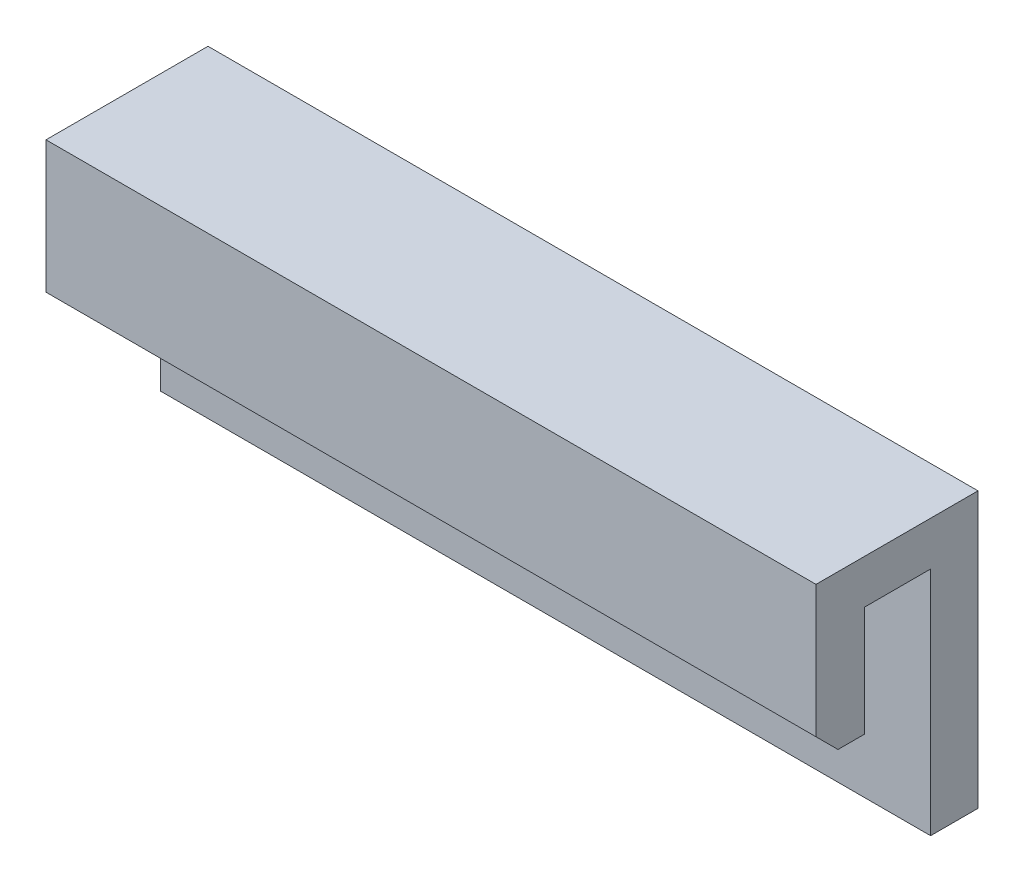
ISO-10303-21;
HEADER;
FILE_DESCRIPTION(('STEP AP214'),'2;1');
FILE_NAME('part.step','',(''),(''),'','','');
FILE_SCHEMA(('AUTOMOTIVE_DESIGN { 1 0 10303 214 1 1 1 1 }'));
ENDSEC;
DATA;
#1=APPLICATION_CONTEXT('core data for automotive mechanical design processes');
#2=APPLICATION_PROTOCOL_DEFINITION('international standard','automotive_design',2000,#1);
#3=PRODUCT_CONTEXT('',#1,'mechanical');
#4=PRODUCT('Part','Part','',(#3));
#5=PRODUCT_RELATED_PRODUCT_CATEGORY('part','',(#4));
#6=PRODUCT_DEFINITION_FORMATION('','',#4);
#7=PRODUCT_DEFINITION_CONTEXT('part definition',#1,'design');
#8=PRODUCT_DEFINITION('design','',#6,#7);
#9=PRODUCT_DEFINITION_SHAPE('','',#8);
#10=(LENGTH_UNIT() NAMED_UNIT(*) SI_UNIT(.MILLI.,.METRE.));
#11=(NAMED_UNIT(*) PLANE_ANGLE_UNIT() SI_UNIT($,.RADIAN.));
#12=(NAMED_UNIT(*) SI_UNIT($,.STERADIAN.) SOLID_ANGLE_UNIT());
#13=UNCERTAINTY_MEASURE_WITH_UNIT(LENGTH_MEASURE(1.E-05),#10,'distance_accuracy_value','');
#14=(GEOMETRIC_REPRESENTATION_CONTEXT(3) GLOBAL_UNCERTAINTY_ASSIGNED_CONTEXT((#13)) GLOBAL_UNIT_ASSIGNED_CONTEXT((#10,
#11,#12)) REPRESENTATION_CONTEXT('',''));
#15=CARTESIAN_POINT('',(0.,0.,0.));
#16=DIRECTION('',(0.,0.,1.));
#17=DIRECTION('',(1.,0.,0.));
#18=AXIS2_PLACEMENT_3D('',#15,#16,#17);
#19=CARTESIAN_POINT('',(70.,6.01818181818182,7.20000000000001));
#20=DIRECTION('',(0.,0.,-1.));
#21=DIRECTION('',(0.,1.,0.));
#22=AXIS2_PLACEMENT_3D('',#19,#20,#21);
#23=PLANE('',#22);
#24=DIRECTION('',(0.,-1.,0.));
#25=VECTOR('',#24,1.);
#26=CARTESIAN_POINT('',(0.,6.01818181818182,7.20000000000001));
#27=LINE('',#26,#25);
#28=CARTESIAN_POINT('',(0.,6.01818181818182,7.20000000000001));
#29=VERTEX_POINT('',#28);
#30=CARTESIAN_POINT('',(0.,-5.98181818181816,7.2));
#31=VERTEX_POINT('',#30);
#32=EDGE_CURVE('E141',#29,#31,#27,.T.);
#33=ORIENTED_EDGE('',*,*,#32,.T.);
#34=DIRECTION('',(1.,0.,0.));
#35=VECTOR('',#34,1.);
#36=CARTESIAN_POINT('',(70.,-5.98181818181816,7.2));
#37=LINE('',#36,#35);
#38=CARTESIAN_POINT('',(70.,-5.98181818181816,7.2));
#39=VERTEX_POINT('',#38);
#40=EDGE_CURVE('E41',#31,#39,#37,.T.);
#41=ORIENTED_EDGE('',*,*,#40,.T.);
#42=DIRECTION('',(0.,-1.,0.));
#43=VECTOR('',#42,1.);
#44=CARTESIAN_POINT('',(70.,6.01818181818182,7.20000000000001));
#45=LINE('',#44,#43);
#46=CARTESIAN_POINT('',(70.,6.01818181818182,7.20000000000001));
#47=VERTEX_POINT('',#46);
#48=EDGE_CURVE('E113',#47,#39,#45,.T.);
#49=ORIENTED_EDGE('',*,*,#48,.F.);
#50=DIRECTION('',(-1.,0.,0.));
#51=VECTOR('',#50,1.);
#52=CARTESIAN_POINT('',(70.,6.01818181818182,7.20000000000001));
#53=LINE('',#52,#51);
#54=EDGE_CURVE('E140',#47,#29,#53,.T.);
#55=ORIENTED_EDGE('',*,*,#54,.T.);
#56=EDGE_LOOP('',(#33,#41,#49,#55));
#57=FACE_BOUND('',#56,.T.);
#58=ADVANCED_FACE('F33',(#57),#23,.F.);
#59=CARTESIAN_POINT('',(70.,-7.98181818181818,7.2));
#60=DIRECTION('',(0.,1.,0.));
#61=DIRECTION('',(0.,0.,1.));
#62=AXIS2_PLACEMENT_3D('',#59,#60,#61);
#63=PLANE('',#62);
#64=DIRECTION('',(0.,0.,-1.));
#65=VECTOR('',#64,1.);
#66=CARTESIAN_POINT('',(70.,-7.98181818181818,7.2));
#67=LINE('',#66,#65);
#68=CARTESIAN_POINT('',(70.,-7.98181818181818,5.2));
#69=VERTEX_POINT('',#68);
#70=CARTESIAN_POINT('',(70.,-7.98181818181818,2.78181818181818));
#71=VERTEX_POINT('',#70);
#72=EDGE_CURVE('E103',#69,#71,#67,.T.);
#73=ORIENTED_EDGE('',*,*,#72,.F.);
#74=DIRECTION('',(-1.,0.,0.));
#75=VECTOR('',#74,1.);
#76=CARTESIAN_POINT('',(70.,-7.98181818181818,5.2));
#77=LINE('',#76,#75);
#78=CARTESIAN_POINT('',(0.,-7.98181818181818,5.2));
#79=VERTEX_POINT('',#78);
#80=EDGE_CURVE('E121',#69,#79,#77,.T.);
#81=ORIENTED_EDGE('',*,*,#80,.T.);
#82=DIRECTION('',(0.,0.,-1.));
#83=VECTOR('',#82,1.);
#84=CARTESIAN_POINT('',(0.,-7.98181818181818,7.2));
#85=LINE('',#84,#83);
#86=CARTESIAN_POINT('',(0.,-7.98181818181818,2.78181818181818));
#87=VERTEX_POINT('',#86);
#88=EDGE_CURVE('E118',#79,#87,#85,.T.);
#89=ORIENTED_EDGE('',*,*,#88,.T.);
#90=DIRECTION('',(-1.,0.,0.));
#91=VECTOR('',#90,1.);
#92=CARTESIAN_POINT('',(70.,-7.98181818181818,2.78181818181818));
#93=LINE('',#92,#91);
#94=EDGE_CURVE('E116',#71,#87,#93,.T.);
#95=ORIENTED_EDGE('',*,*,#94,.F.);
#96=EDGE_LOOP('',(#73,#81,#89,#95));
#97=FACE_BOUND('',#96,.T.);
#98=ADVANCED_FACE('F117',(#97),#63,.F.);
#99=CARTESIAN_POINT('',(70.,-7.98181818181818,2.78181818181818));
#100=DIRECTION('',(0.,0.,1.));
#101=DIRECTION('',(0.,-1.,0.));
#102=AXIS2_PLACEMENT_3D('',#99,#100,#101);
#103=PLANE('',#102);
#104=DIRECTION('',(0.,1.,0.));
#105=VECTOR('',#104,1.);
#106=CARTESIAN_POINT('',(0.,-7.98181818181818,2.78181818181818));
#107=LINE('',#106,#105);
#108=CARTESIAN_POINT('',(0.,2.01818181818182,2.78181818181818));
#109=VERTEX_POINT('',#108);
#110=EDGE_CURVE('E144',#87,#109,#107,.T.);
#111=ORIENTED_EDGE('',*,*,#110,.T.);
#112=DIRECTION('',(-1.,0.,0.));
#113=VECTOR('',#112,1.);
#114=CARTESIAN_POINT('',(70.,2.01818181818182,2.78181818181818));
#115=LINE('',#114,#113);
#116=CARTESIAN_POINT('',(70.,2.01818181818182,2.78181818181818));
#117=VERTEX_POINT('',#116);
#118=EDGE_CURVE('E122',#117,#109,#115,.T.);
#119=ORIENTED_EDGE('',*,*,#118,.F.);
#120=DIRECTION('',(0.,1.,0.));
#121=VECTOR('',#120,1.);
#122=CARTESIAN_POINT('',(70.,-7.98181818181818,2.78181818181818));
#123=LINE('',#122,#121);
#124=EDGE_CURVE('E107',#71,#117,#123,.T.);
#125=ORIENTED_EDGE('',*,*,#124,.F.);
#126=ORIENTED_EDGE('',*,*,#94,.T.);
#127=EDGE_LOOP('',(#111,#119,#125,#126));
#128=FACE_BOUND('',#127,.T.);
#129=ADVANCED_FACE('F124',(#128),#103,.F.);
#130=CARTESIAN_POINT('',(70.,2.01818181818182,2.78181818181818));
#131=DIRECTION('',(0.,1.,0.));
#132=DIRECTION('',(0.,0.,1.));
#133=AXIS2_PLACEMENT_3D('',#130,#131,#132);
#134=PLANE('',#133);
#135=DIRECTION('',(0.,0.,-1.));
#136=VECTOR('',#135,1.);
#137=CARTESIAN_POINT('',(0.,2.01818181818182,2.78181818181818));
#138=LINE('',#137,#136);
#139=CARTESIAN_POINT('',(0.,2.01818181818182,-3.21818181818182));
#140=VERTEX_POINT('',#139);
#141=EDGE_CURVE('E146',#109,#140,#138,.T.);
#142=ORIENTED_EDGE('',*,*,#141,.T.);
#143=DIRECTION('',(-1.,0.,0.));
#144=VECTOR('',#143,1.);
#145=CARTESIAN_POINT('',(70.,2.01818181818182,-3.21818181818182));
#146=LINE('',#145,#144);
#147=CARTESIAN_POINT('',(70.,2.01818181818182,-3.21818181818182));
#148=VERTEX_POINT('',#147);
#149=EDGE_CURVE('E169',#148,#140,#146,.T.);
#150=ORIENTED_EDGE('',*,*,#149,.F.);
#151=DIRECTION('',(0.,0.,-1.));
#152=VECTOR('',#151,1.);
#153=CARTESIAN_POINT('',(70.,2.01818181818182,2.78181818181818));
#154=LINE('',#153,#152);
#155=EDGE_CURVE('E127',#117,#148,#154,.T.);
#156=ORIENTED_EDGE('',*,*,#155,.F.);
#157=ORIENTED_EDGE('',*,*,#118,.T.);
#158=EDGE_LOOP('',(#142,#150,#156,#157));
#159=FACE_BOUND('',#158,.T.);
#160=ADVANCED_FACE('F178',(#159),#134,.F.);
#161=CARTESIAN_POINT('',(70.,-7.98181818181818,-3.21818181818182));
#162=DIRECTION('',(0.,0.,-1.));
#163=DIRECTION('',(0.,1.,0.));
#164=AXIS2_PLACEMENT_3D('',#161,#162,#163);
#165=PLANE('',#164);
#166=DIRECTION('',(0.,-1.,0.));
#167=VECTOR('',#166,1.);
#168=CARTESIAN_POINT('',(0.,-7.98181818181818,-3.21818181818182));
#169=LINE('',#168,#167);
#170=CARTESIAN_POINT('',(0.,-18.9818181818182,-3.21818181818182));
#171=VERTEX_POINT('',#170);
#172=EDGE_CURVE('E149',#140,#171,#169,.T.);
#173=ORIENTED_EDGE('',*,*,#172,.T.);
#174=DIRECTION('',(-1.,0.,0.));
#175=VECTOR('',#174,1.);
#176=CARTESIAN_POINT('',(70.,-18.9818181818182,-3.21818181818182));
#177=LINE('',#176,#175);
#178=CARTESIAN_POINT('',(70.,-18.9818181818182,-3.21818181818182));
#179=VERTEX_POINT('',#178);
#180=EDGE_CURVE('E166',#179,#171,#177,.T.);
#181=ORIENTED_EDGE('',*,*,#180,.F.);
#182=DIRECTION('',(0.,-1.,0.));
#183=VECTOR('',#182,1.);
#184=CARTESIAN_POINT('',(70.,-7.98181818181818,-3.21818181818182));
#185=LINE('',#184,#183);
#186=EDGE_CURVE('E129',#148,#179,#185,.T.);
#187=ORIENTED_EDGE('',*,*,#186,.F.);
#188=ORIENTED_EDGE('',*,*,#149,.T.);
#189=EDGE_LOOP('',(#173,#181,#187,#188));
#190=FACE_BOUND('',#189,.T.);
#191=ADVANCED_FACE('F185',(#190),#165,.F.);
#192=CARTESIAN_POINT('',(70.,-18.9818181818182,-3.21818181818182));
#193=DIRECTION('',(0.,1.,0.));
#194=DIRECTION('',(0.,0.,1.));
#195=AXIS2_PLACEMENT_3D('',#192,#193,#194);
#196=PLANE('',#195);
#197=DIRECTION('',(0.,0.,-1.));
#198=VECTOR('',#197,1.);
#199=CARTESIAN_POINT('',(0.,-18.9818181818182,-3.21818181818182));
#200=LINE('',#199,#198);
#201=CARTESIAN_POINT('',(0.,-18.9818181818182,-7.52727272727273));
#202=VERTEX_POINT('',#201);
#203=EDGE_CURVE('E151',#171,#202,#200,.T.);
#204=ORIENTED_EDGE('',*,*,#203,.T.);
#205=DIRECTION('',(-1.,0.,0.));
#206=VECTOR('',#205,1.);
#207=CARTESIAN_POINT('',(70.,-18.9818181818182,-7.52727272727273));
#208=LINE('',#207,#206);
#209=CARTESIAN_POINT('',(70.,-18.9818181818182,-7.52727272727273));
#210=VERTEX_POINT('',#209);
#211=EDGE_CURVE('E163',#210,#202,#208,.T.);
#212=ORIENTED_EDGE('',*,*,#211,.F.);
#213=DIRECTION('',(0.,0.,-1.));
#214=VECTOR('',#213,1.);
#215=CARTESIAN_POINT('',(70.,-18.9818181818182,-3.21818181818182));
#216=LINE('',#215,#214);
#217=EDGE_CURVE('E134',#179,#210,#216,.T.);
#218=ORIENTED_EDGE('',*,*,#217,.F.);
#219=ORIENTED_EDGE('',*,*,#180,.T.);
#220=EDGE_LOOP('',(#204,#212,#218,#219));
#221=FACE_BOUND('',#220,.T.);
#222=ADVANCED_FACE('F188',(#221),#196,.F.);
#223=CARTESIAN_POINT('',(70.,6.01818181818182,-7.52727272727273));
#224=DIRECTION('',(0.,0.,1.));
#225=DIRECTION('',(0.,-1.,0.));
#226=AXIS2_PLACEMENT_3D('',#223,#224,#225);
#227=PLANE('',#226);
#228=DIRECTION('',(0.,1.,0.));
#229=VECTOR('',#228,1.);
#230=CARTESIAN_POINT('',(0.,6.01818181818182,-7.52727272727273));
#231=LINE('',#230,#229);
#232=CARTESIAN_POINT('',(0.,6.01818181818182,-7.52727272727273));
#233=VERTEX_POINT('',#232);
#234=EDGE_CURVE('E154',#202,#233,#231,.T.);
#235=ORIENTED_EDGE('',*,*,#234,.T.);
#236=DIRECTION('',(-1.,0.,0.));
#237=VECTOR('',#236,1.);
#238=CARTESIAN_POINT('',(70.,6.01818181818182,-7.52727272727273));
#239=LINE('',#238,#237);
#240=CARTESIAN_POINT('',(70.,6.01818181818182,-7.52727272727273));
#241=VERTEX_POINT('',#240);
#242=EDGE_CURVE('E160',#241,#233,#239,.T.);
#243=ORIENTED_EDGE('',*,*,#242,.F.);
#244=DIRECTION('',(0.,1.,0.));
#245=VECTOR('',#244,1.);
#246=CARTESIAN_POINT('',(70.,-10.3818181818182,-7.52727272727273));
#247=LINE('',#246,#245);
#248=EDGE_CURVE('E136',#210,#241,#247,.T.);
#249=ORIENTED_EDGE('',*,*,#248,.F.);
#250=ORIENTED_EDGE('',*,*,#211,.T.);
#251=EDGE_LOOP('',(#235,#243,#249,#250));
#252=FACE_BOUND('',#251,.T.);
#253=ADVANCED_FACE('F192',(#252),#227,.F.);
#254=CARTESIAN_POINT('',(70.,6.01818181818182,7.20000000000001));
#255=DIRECTION('',(0.,-1.,0.));
#256=DIRECTION('',(0.,0.,-1.));
#257=AXIS2_PLACEMENT_3D('',#254,#255,#256);
#258=PLANE('',#257);
#259=DIRECTION('',(0.,0.,1.));
#260=VECTOR('',#259,1.);
#261=CARTESIAN_POINT('',(0.,6.01818181818182,7.20000000000001));
#262=LINE('',#261,#260);
#263=EDGE_CURVE('E156',#233,#29,#262,.T.);
#264=ORIENTED_EDGE('',*,*,#263,.T.);
#265=ORIENTED_EDGE('',*,*,#54,.F.);
#266=DIRECTION('',(0.,0.,1.));
#267=VECTOR('',#266,1.);
#268=CARTESIAN_POINT('',(70.,6.01818181818182,7.20000000000001));
#269=LINE('',#268,#267);
#270=EDGE_CURVE('E138',#241,#47,#269,.T.);
#271=ORIENTED_EDGE('',*,*,#270,.F.);
#272=ORIENTED_EDGE('',*,*,#242,.T.);
#273=EDGE_LOOP('',(#264,#265,#271,#272));
#274=FACE_BOUND('',#273,.T.);
#275=ADVANCED_FACE('F196',(#274),#258,.F.);
#276=CARTESIAN_POINT('',(70.,0.,0.));
#277=DIRECTION('',(1.,0.,0.));
#278=DIRECTION('',(0.,0.,-1.));
#279=AXIS2_PLACEMENT_3D('',#276,#277,#278);
#280=PLANE('',#279);
#281=ORIENTED_EDGE('',*,*,#48,.T.);
#282=DIRECTION('',(0.,0.707106781186549,0.707106781186546));
#283=VECTOR('',#282,1.);
#284=CARTESIAN_POINT('',(70.,-6.59090909090907,6.5909090909091));
#285=LINE('',#284,#283);
#286=EDGE_CURVE('E11',#39,#69,#285,.F.);
#287=ORIENTED_EDGE('',*,*,#286,.T.);
#288=ORIENTED_EDGE('',*,*,#72,.T.);
#289=ORIENTED_EDGE('',*,*,#124,.T.);
#290=ORIENTED_EDGE('',*,*,#155,.T.);
#291=ORIENTED_EDGE('',*,*,#186,.T.);
#292=ORIENTED_EDGE('',*,*,#217,.T.);
#293=ORIENTED_EDGE('',*,*,#248,.T.);
#294=ORIENTED_EDGE('',*,*,#270,.T.);
#295=EDGE_LOOP('',(#281,#287,#288,#289,#290,#291,#292,#293,#294));
#296=FACE_BOUND('',#295,.T.);
#297=ADVANCED_FACE('F105',(#296),#280,.T.);
#298=CARTESIAN_POINT('',(0.,0.,0.));
#299=DIRECTION('',(1.,0.,0.));
#300=DIRECTION('',(0.,0.,-1.));
#301=AXIS2_PLACEMENT_3D('',#298,#299,#300);
#302=PLANE('',#301);
#303=ORIENTED_EDGE('',*,*,#88,.F.);
#304=DIRECTION('',(0.,-0.707106781186549,-0.707106781186546));
#305=VECTOR('',#304,1.);
#306=CARTESIAN_POINT('',(0.,-7.98181818181818,5.2));
#307=LINE('',#306,#305);
#308=EDGE_CURVE('E55',#79,#31,#307,.F.);
#309=ORIENTED_EDGE('',*,*,#308,.T.);
#310=ORIENTED_EDGE('',*,*,#32,.F.);
#311=ORIENTED_EDGE('',*,*,#263,.F.);
#312=ORIENTED_EDGE('',*,*,#234,.F.);
#313=ORIENTED_EDGE('',*,*,#203,.F.);
#314=ORIENTED_EDGE('',*,*,#172,.F.);
#315=ORIENTED_EDGE('',*,*,#141,.F.);
#316=ORIENTED_EDGE('',*,*,#110,.F.);
#317=EDGE_LOOP('',(#303,#309,#310,#311,#312,#313,#314,#315,#316));
#318=FACE_BOUND('',#317,.T.);
#319=ADVANCED_FACE('F175',(#318),#302,.F.);
#320=CARTESIAN_POINT('',(70.,-7.98181818181818,5.2));
#321=DIRECTION('',(0.,0.707106781186546,-0.707106781186549));
#322=DIRECTION('',(-1.,0.,0.));
#323=AXIS2_PLACEMENT_3D('',#320,#321,#322);
#324=PLANE('',#323);
#325=ORIENTED_EDGE('',*,*,#286,.F.);
#326=ORIENTED_EDGE('',*,*,#40,.F.);
#327=ORIENTED_EDGE('',*,*,#308,.F.);
#328=ORIENTED_EDGE('',*,*,#80,.F.);
#329=EDGE_LOOP('',(#325,#326,#327,#328));
#330=FACE_BOUND('',#329,.T.);
#331=ADVANCED_FACE('F35',(#330),#324,.F.);
#332=CLOSED_SHELL('',(#58,#98,#129,#160,#191,#222,#253,#275,#297,#319,#331));
#333=MANIFOLD_SOLID_BREP('B2',#332);
#334=ADVANCED_BREP_SHAPE_REPRESENTATION('',(#18,#333),#14);
#335=SHAPE_DEFINITION_REPRESENTATION(#9,#334);
ENDSEC;
END-ISO-10303-21;
